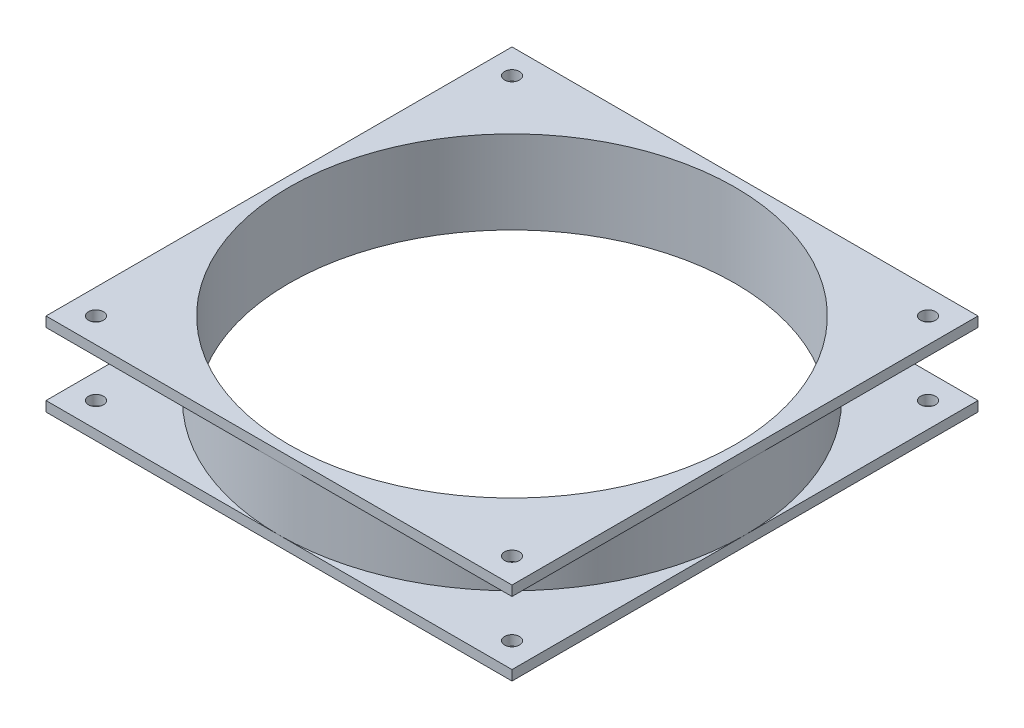
ISO-10303-21;
HEADER;
FILE_DESCRIPTION(('STEP AP214'),'2;1');
FILE_NAME('part.step','',(''),(''),'','','');
FILE_SCHEMA(('AUTOMOTIVE_DESIGN { 1 0 10303 214 1 1 1 1 }'));
ENDSEC;
DATA;
#1=APPLICATION_CONTEXT('core data for automotive mechanical design processes');
#2=APPLICATION_PROTOCOL_DEFINITION('international standard','automotive_design',2000,#1);
#3=PRODUCT_CONTEXT('',#1,'mechanical');
#4=PRODUCT('Part','Part','',(#3));
#5=PRODUCT_RELATED_PRODUCT_CATEGORY('part','',(#4));
#6=PRODUCT_DEFINITION_FORMATION('','',#4);
#7=PRODUCT_DEFINITION_CONTEXT('part definition',#1,'design');
#8=PRODUCT_DEFINITION('design','',#6,#7);
#9=PRODUCT_DEFINITION_SHAPE('','',#8);
#10=(LENGTH_UNIT() NAMED_UNIT(*) SI_UNIT(.MILLI.,.METRE.));
#11=(NAMED_UNIT(*) PLANE_ANGLE_UNIT() SI_UNIT($,.RADIAN.));
#12=(NAMED_UNIT(*) SI_UNIT($,.STERADIAN.) SOLID_ANGLE_UNIT());
#13=UNCERTAINTY_MEASURE_WITH_UNIT(LENGTH_MEASURE(1.E-05),#10,'distance_accuracy_value','');
#14=(GEOMETRIC_REPRESENTATION_CONTEXT(3) GLOBAL_UNCERTAINTY_ASSIGNED_CONTEXT((#13)) GLOBAL_UNIT_ASSIGNED_CONTEXT((#10,
#11,#12)) REPRESENTATION_CONTEXT('',''));
#15=CARTESIAN_POINT('',(0.,0.,0.));
#16=DIRECTION('',(0.,0.,1.));
#17=DIRECTION('',(1.,0.,0.));
#18=AXIS2_PLACEMENT_3D('',#15,#16,#17);
#19=CARTESIAN_POINT('',(67.,0.,0.));
#20=DIRECTION('',(0.,-1.,0.));
#21=DIRECTION('',(0.,0.,-1.));
#22=AXIS2_PLACEMENT_3D('',#19,#20,#21);
#23=PLANE('',#22);
#24=CARTESIAN_POINT('',(-62.5,0.,-62.5));
#25=DIRECTION('',(0.,1.,0.));
#26=DIRECTION('',(0.,0.,1.));
#27=AXIS2_PLACEMENT_3D('',#24,#25,#26);
#28=CIRCLE('',#27,2.25);
#29=CARTESIAN_POINT('',(-62.5,0.,-60.25));
#30=VERTEX_POINT('',#29);
#31=EDGE_CURVE('E308',#30,#30,#28,.T.);
#32=ORIENTED_EDGE('',*,*,#31,.T.);
#33=EDGE_LOOP('',(#32));
#34=FACE_BOUND('',#33,.T.);
#35=CARTESIAN_POINT('',(62.5,0.,62.5));
#36=DIRECTION('',(0.,1.,0.));
#37=DIRECTION('',(0.,0.,1.));
#38=AXIS2_PLACEMENT_3D('',#35,#36,#37);
#39=CIRCLE('',#38,2.25);
#40=CARTESIAN_POINT('',(62.5,0.,64.75));
#41=VERTEX_POINT('',#40);
#42=EDGE_CURVE('E228',#41,#41,#39,.T.);
#43=ORIENTED_EDGE('',*,*,#42,.T.);
#44=EDGE_LOOP('',(#43));
#45=FACE_BOUND('',#44,.T.);
#46=CARTESIAN_POINT('',(-62.5,0.,62.5));
#47=DIRECTION('',(0.,1.,0.));
#48=DIRECTION('',(0.,0.,1.));
#49=AXIS2_PLACEMENT_3D('',#46,#47,#48);
#50=CIRCLE('',#49,2.25);
#51=CARTESIAN_POINT('',(-62.5,0.,64.75));
#52=VERTEX_POINT('',#51);
#53=EDGE_CURVE('E224',#52,#52,#50,.T.);
#54=ORIENTED_EDGE('',*,*,#53,.T.);
#55=EDGE_LOOP('',(#54));
#56=FACE_BOUND('',#55,.T.);
#57=CARTESIAN_POINT('',(62.5,0.,-62.5));
#58=DIRECTION('',(0.,1.,0.));
#59=DIRECTION('',(0.,0.,1.));
#60=AXIS2_PLACEMENT_3D('',#57,#58,#59);
#61=CIRCLE('',#60,2.25);
#62=CARTESIAN_POINT('',(62.5,0.,-60.25));
#63=VERTEX_POINT('',#62);
#64=EDGE_CURVE('E220',#63,#63,#61,.T.);
#65=ORIENTED_EDGE('',*,*,#64,.T.);
#66=EDGE_LOOP('',(#65));
#67=FACE_BOUND('',#66,.T.);
#68=CARTESIAN_POINT('',(0.,0.,0.));
#69=DIRECTION('',(0.,-1.,0.));
#70=DIRECTION('',(0.,0.,-1.));
#71=AXIS2_PLACEMENT_3D('',#68,#69,#70);
#72=CIRCLE('',#71,67.);
#73=CARTESIAN_POINT('',(0.,0.,-67.));
#74=VERTEX_POINT('',#73);
#75=EDGE_CURVE('E12',#74,#74,#72,.T.);
#76=ORIENTED_EDGE('',*,*,#75,.F.);
#77=EDGE_LOOP('',(#76));
#78=FACE_BOUND('',#77,.T.);
#79=DIRECTION('',(-1.,0.,0.));
#80=VECTOR('',#79,1.);
#81=CARTESIAN_POINT('',(-70.,0.,-70.));
#82=LINE('',#81,#80);
#83=CARTESIAN_POINT('',(70.,0.,-70.));
#84=VERTEX_POINT('',#83);
#85=CARTESIAN_POINT('',(-70.,0.,-70.));
#86=VERTEX_POINT('',#85);
#87=EDGE_CURVE('E150',#84,#86,#82,.T.);
#88=ORIENTED_EDGE('',*,*,#87,.F.);
#89=DIRECTION('',(0.,0.,-1.));
#90=VECTOR('',#89,1.);
#91=CARTESIAN_POINT('',(70.,0.,70.));
#92=LINE('',#91,#90);
#93=CARTESIAN_POINT('',(70.,0.,70.));
#94=VERTEX_POINT('',#93);
#95=EDGE_CURVE('E57',#94,#84,#92,.T.);
#96=ORIENTED_EDGE('',*,*,#95,.F.);
#97=DIRECTION('',(1.,0.,0.));
#98=VECTOR('',#97,1.);
#99=CARTESIAN_POINT('',(-70.,0.,70.));
#100=LINE('',#99,#98);
#101=CARTESIAN_POINT('',(-70.,0.,70.));
#102=VERTEX_POINT('',#101);
#103=EDGE_CURVE('E137',#102,#94,#100,.T.);
#104=ORIENTED_EDGE('',*,*,#103,.F.);
#105=DIRECTION('',(0.,0.,1.));
#106=VECTOR('',#105,1.);
#107=CARTESIAN_POINT('',(-70.,0.,70.));
#108=LINE('',#107,#106);
#109=EDGE_CURVE('E146',#86,#102,#108,.T.);
#110=ORIENTED_EDGE('',*,*,#109,.F.);
#111=EDGE_LOOP('',(#88,#96,#104,#110));
#112=FACE_BOUND('',#111,.T.);
#113=ADVANCED_FACE('F40',(#34,#45,#56,#67,#78,#112),#23,.T.);
#114=CARTESIAN_POINT('',(0.,0.,0.));
#115=DIRECTION('',(0.,-1.,0.));
#116=DIRECTION('',(0.,0.,-1.));
#117=AXIS2_PLACEMENT_3D('',#114,#115,#116);
#118=CYLINDRICAL_SURFACE('',#117,67.);
#119=ORIENTED_EDGE('',*,*,#75,.T.);
#120=EDGE_LOOP('',(#119));
#121=FACE_BOUND('',#120,.T.);
#122=CARTESIAN_POINT('',(0.,25.,0.));
#123=DIRECTION('',(0.,-1.,0.));
#124=DIRECTION('',(0.,0.,-1.));
#125=AXIS2_PLACEMENT_3D('',#122,#123,#124);
#126=CIRCLE('',#125,67.);
#127=CARTESIAN_POINT('',(0.,25.,-67.));
#128=VERTEX_POINT('',#127);
#129=EDGE_CURVE('E205',#128,#128,#126,.T.);
#130=ORIENTED_EDGE('',*,*,#129,.F.);
#131=EDGE_LOOP('',(#130));
#132=FACE_BOUND('',#131,.T.);
#133=ADVANCED_FACE('F42',(#121,#132),#118,.F.);
#134=CARTESIAN_POINT('',(100.,25.,0.));
#135=DIRECTION('',(0.,1.,0.));
#136=DIRECTION('',(0.,0.,1.));
#137=AXIS2_PLACEMENT_3D('',#134,#135,#136);
#138=PLANE('',#137);
#139=CARTESIAN_POINT('',(-62.5,25.,-62.5));
#140=DIRECTION('',(0.,1.,0.));
#141=DIRECTION('',(0.,0.,1.));
#142=AXIS2_PLACEMENT_3D('',#139,#140,#141);
#143=CIRCLE('',#142,2.24999999999999);
#144=CARTESIAN_POINT('',(-62.5,25.,-60.25));
#145=VERTEX_POINT('',#144);
#146=EDGE_CURVE('E374',#145,#145,#143,.T.);
#147=ORIENTED_EDGE('',*,*,#146,.F.);
#148=EDGE_LOOP('',(#147));
#149=FACE_BOUND('',#148,.T.);
#150=CARTESIAN_POINT('',(62.5,25.,62.5));
#151=DIRECTION('',(0.,1.,0.));
#152=DIRECTION('',(0.,0.,1.));
#153=AXIS2_PLACEMENT_3D('',#150,#151,#152);
#154=CIRCLE('',#153,2.24999999999999);
#155=CARTESIAN_POINT('',(62.5,25.,64.75));
#156=VERTEX_POINT('',#155);
#157=EDGE_CURVE('E235',#156,#156,#154,.T.);
#158=ORIENTED_EDGE('',*,*,#157,.F.);
#159=EDGE_LOOP('',(#158));
#160=FACE_BOUND('',#159,.T.);
#161=CARTESIAN_POINT('',(-62.5,25.,62.5));
#162=DIRECTION('',(0.,1.,0.));
#163=DIRECTION('',(0.,0.,1.));
#164=AXIS2_PLACEMENT_3D('',#161,#162,#163);
#165=CIRCLE('',#164,2.24999999999999);
#166=CARTESIAN_POINT('',(-62.5,25.,64.75));
#167=VERTEX_POINT('',#166);
#168=EDGE_CURVE('E232',#167,#167,#165,.T.);
#169=ORIENTED_EDGE('',*,*,#168,.F.);
#170=EDGE_LOOP('',(#169));
#171=FACE_BOUND('',#170,.T.);
#172=CARTESIAN_POINT('',(62.5,25.,-62.5));
#173=DIRECTION('',(0.,1.,0.));
#174=DIRECTION('',(0.,0.,1.));
#175=AXIS2_PLACEMENT_3D('',#172,#173,#174);
#176=CIRCLE('',#175,2.24999999999999);
#177=CARTESIAN_POINT('',(62.5,25.,-60.25));
#178=VERTEX_POINT('',#177);
#179=EDGE_CURVE('E250',#178,#178,#176,.T.);
#180=ORIENTED_EDGE('',*,*,#179,.F.);
#181=EDGE_LOOP('',(#180));
#182=FACE_BOUND('',#181,.T.);
#183=ORIENTED_EDGE('',*,*,#129,.T.);
#184=EDGE_LOOP('',(#183));
#185=FACE_BOUND('',#184,.T.);
#186=DIRECTION('',(1.,0.,0.));
#187=VECTOR('',#186,1.);
#188=CARTESIAN_POINT('',(-70.,25.,70.));
#189=LINE('',#188,#187);
#190=CARTESIAN_POINT('',(-70.,25.,70.));
#191=VERTEX_POINT('',#190);
#192=CARTESIAN_POINT('',(70.,25.,70.));
#193=VERTEX_POINT('',#192);
#194=EDGE_CURVE('E168',#191,#193,#189,.T.);
#195=ORIENTED_EDGE('',*,*,#194,.T.);
#196=DIRECTION('',(0.,0.,-1.));
#197=VECTOR('',#196,1.);
#198=CARTESIAN_POINT('',(70.,25.,70.));
#199=LINE('',#198,#197);
#200=CARTESIAN_POINT('',(70.,25.,-70.));
#201=VERTEX_POINT('',#200);
#202=EDGE_CURVE('E158',#193,#201,#199,.T.);
#203=ORIENTED_EDGE('',*,*,#202,.T.);
#204=DIRECTION('',(-1.,0.,0.));
#205=VECTOR('',#204,1.);
#206=CARTESIAN_POINT('',(-70.,25.,-70.));
#207=LINE('',#206,#205);
#208=CARTESIAN_POINT('',(-70.,25.,-70.));
#209=VERTEX_POINT('',#208);
#210=EDGE_CURVE('E161',#201,#209,#207,.T.);
#211=ORIENTED_EDGE('',*,*,#210,.T.);
#212=DIRECTION('',(0.,0.,1.));
#213=VECTOR('',#212,1.);
#214=CARTESIAN_POINT('',(-70.,25.,70.));
#215=LINE('',#214,#213);
#216=EDGE_CURVE('E165',#209,#191,#215,.T.);
#217=ORIENTED_EDGE('',*,*,#216,.T.);
#218=EDGE_LOOP('',(#195,#203,#211,#217));
#219=FACE_BOUND('',#218,.T.);
#220=ADVANCED_FACE('F304',(#149,#160,#171,#182,#185,#219),#138,.T.);
#221=CARTESIAN_POINT('',(-70.,0.,-70.));
#222=DIRECTION('',(0.,0.,-1.));
#223=DIRECTION('',(-1.,0.,0.));
#224=AXIS2_PLACEMENT_3D('',#221,#222,#223);
#225=PLANE('',#224);
#226=DIRECTION('',(0.,1.,0.));
#227=VECTOR('',#226,1.);
#228=CARTESIAN_POINT('',(-70.,0.,-70.));
#229=LINE('',#228,#227);
#230=CARTESIAN_POINT('',(-70.,22.,-70.));
#231=VERTEX_POINT('',#230);
#232=EDGE_CURVE('E174',#231,#209,#229,.T.);
#233=ORIENTED_EDGE('',*,*,#232,.T.);
#234=ORIENTED_EDGE('',*,*,#210,.F.);
#235=DIRECTION('',(0.,1.,0.));
#236=VECTOR('',#235,1.);
#237=CARTESIAN_POINT('',(70.,0.,-70.));
#238=LINE('',#237,#236);
#239=CARTESIAN_POINT('',(70.,22.,-70.));
#240=VERTEX_POINT('',#239);
#241=EDGE_CURVE('E152',#240,#201,#238,.T.);
#242=ORIENTED_EDGE('',*,*,#241,.F.);
#243=DIRECTION('',(1.,0.,0.));
#244=VECTOR('',#243,1.);
#245=CARTESIAN_POINT('',(70.,22.,-70.));
#246=LINE('',#245,#244);
#247=CARTESIAN_POINT('',(0.,22.,-70.));
#248=VERTEX_POINT('',#247);
#249=EDGE_CURVE('E172',#248,#240,#246,.T.);
#250=ORIENTED_EDGE('',*,*,#249,.F.);
#251=EDGE_CURVE('E178',#231,#248,#246,.T.);
#252=ORIENTED_EDGE('',*,*,#251,.F.);
#253=EDGE_LOOP('',(#233,#234,#242,#250,#252));
#254=FACE_BOUND('',#253,.T.);
#255=ADVANCED_FACE('F319',(#254),#225,.T.);
#256=CARTESIAN_POINT('',(-70.,0.,70.));
#257=DIRECTION('',(-1.,0.,0.));
#258=DIRECTION('',(0.,0.,1.));
#259=AXIS2_PLACEMENT_3D('',#256,#257,#258);
#260=PLANE('',#259);
#261=DIRECTION('',(0.,1.,0.));
#262=VECTOR('',#261,1.);
#263=CARTESIAN_POINT('',(-70.,0.,70.));
#264=LINE('',#263,#262);
#265=CARTESIAN_POINT('',(-70.,22.,70.));
#266=VERTEX_POINT('',#265);
#267=EDGE_CURVE('E143',#266,#191,#264,.T.);
#268=ORIENTED_EDGE('',*,*,#267,.T.);
#269=ORIENTED_EDGE('',*,*,#216,.F.);
#270=ORIENTED_EDGE('',*,*,#232,.F.);
#271=DIRECTION('',(0.,0.,-1.));
#272=VECTOR('',#271,1.);
#273=CARTESIAN_POINT('',(-70.,22.,0.));
#274=LINE('',#273,#272);
#275=CARTESIAN_POINT('',(-70.,22.,0.));
#276=VERTEX_POINT('',#275);
#277=EDGE_CURVE('E183',#276,#231,#274,.T.);
#278=ORIENTED_EDGE('',*,*,#277,.F.);
#279=EDGE_CURVE('E186',#266,#276,#274,.T.);
#280=ORIENTED_EDGE('',*,*,#279,.F.);
#281=EDGE_LOOP('',(#268,#269,#270,#278,#280));
#282=FACE_BOUND('',#281,.T.);
#283=ADVANCED_FACE('F336',(#282),#260,.T.);
#284=CARTESIAN_POINT('',(-70.,0.,70.));
#285=DIRECTION('',(0.,0.,1.));
#286=DIRECTION('',(1.,0.,0.));
#287=AXIS2_PLACEMENT_3D('',#284,#285,#286);
#288=PLANE('',#287);
#289=DIRECTION('',(0.,1.,0.));
#290=VECTOR('',#289,1.);
#291=CARTESIAN_POINT('',(70.,0.,70.));
#292=LINE('',#291,#290);
#293=CARTESIAN_POINT('',(70.,22.,70.));
#294=VERTEX_POINT('',#293);
#295=EDGE_CURVE('E142',#294,#193,#292,.T.);
#296=ORIENTED_EDGE('',*,*,#295,.T.);
#297=ORIENTED_EDGE('',*,*,#194,.F.);
#298=ORIENTED_EDGE('',*,*,#267,.F.);
#299=DIRECTION('',(-1.,0.,0.));
#300=VECTOR('',#299,1.);
#301=CARTESIAN_POINT('',(70.,22.,70.));
#302=LINE('',#301,#300);
#303=CARTESIAN_POINT('',(0.,22.,70.));
#304=VERTEX_POINT('',#303);
#305=EDGE_CURVE('E190',#304,#266,#302,.T.);
#306=ORIENTED_EDGE('',*,*,#305,.F.);
#307=EDGE_CURVE('E193',#294,#304,#302,.T.);
#308=ORIENTED_EDGE('',*,*,#307,.F.);
#309=EDGE_LOOP('',(#296,#297,#298,#306,#308));
#310=FACE_BOUND('',#309,.T.);
#311=ADVANCED_FACE('F290',(#310),#288,.T.);
#312=CARTESIAN_POINT('',(70.,0.,70.));
#313=DIRECTION('',(1.,0.,0.));
#314=DIRECTION('',(0.,0.,-1.));
#315=AXIS2_PLACEMENT_3D('',#312,#313,#314);
#316=PLANE('',#315);
#317=ORIENTED_EDGE('',*,*,#241,.T.);
#318=ORIENTED_EDGE('',*,*,#202,.F.);
#319=ORIENTED_EDGE('',*,*,#295,.F.);
#320=DIRECTION('',(0.,0.,1.));
#321=VECTOR('',#320,1.);
#322=CARTESIAN_POINT('',(70.,22.,0.));
#323=LINE('',#322,#321);
#324=CARTESIAN_POINT('',(70.,22.,0.));
#325=VERTEX_POINT('',#324);
#326=EDGE_CURVE('E197',#325,#294,#323,.T.);
#327=ORIENTED_EDGE('',*,*,#326,.F.);
#328=EDGE_CURVE('E200',#240,#325,#323,.T.);
#329=ORIENTED_EDGE('',*,*,#328,.F.);
#330=EDGE_LOOP('',(#317,#318,#319,#327,#329));
#331=FACE_BOUND('',#330,.T.);
#332=ADVANCED_FACE('F281',(#331),#316,.T.);
#333=CARTESIAN_POINT('',(100.,3.,0.));
#334=DIRECTION('',(0.,1.,0.));
#335=DIRECTION('',(0.,0.,1.));
#336=AXIS2_PLACEMENT_3D('',#333,#334,#335);
#337=PLANE('',#336);
#338=CARTESIAN_POINT('',(-62.5,3.,62.5));
#339=DIRECTION('',(0.,1.,0.));
#340=DIRECTION('',(0.,0.,1.));
#341=AXIS2_PLACEMENT_3D('',#338,#339,#340);
#342=CIRCLE('',#341,2.24999999999999);
#343=CARTESIAN_POINT('',(-62.5,3.,64.75));
#344=VERTEX_POINT('',#343);
#345=EDGE_CURVE('E221',#344,#344,#342,.T.);
#346=ORIENTED_EDGE('',*,*,#345,.F.);
#347=EDGE_LOOP('',(#346));
#348=FACE_BOUND('',#347,.T.);
#349=DIRECTION('',(0.,0.,1.));
#350=VECTOR('',#349,1.);
#351=CARTESIAN_POINT('',(-70.,3.,0.));
#352=LINE('',#351,#350);
#353=CARTESIAN_POINT('',(-70.,3.,0.));
#354=VERTEX_POINT('',#353);
#355=CARTESIAN_POINT('',(-70.,3.,70.));
#356=VERTEX_POINT('',#355);
#357=EDGE_CURVE('E187',#354,#356,#352,.T.);
#358=ORIENTED_EDGE('',*,*,#357,.T.);
#359=DIRECTION('',(1.,0.,0.));
#360=VECTOR('',#359,1.);
#361=CARTESIAN_POINT('',(100.,3.,70.));
#362=LINE('',#361,#360);
#363=CARTESIAN_POINT('',(0.,3.,70.));
#364=VERTEX_POINT('',#363);
#365=EDGE_CURVE('E139',#356,#364,#362,.T.);
#366=ORIENTED_EDGE('',*,*,#365,.T.);
#367=CARTESIAN_POINT('',(0.,3.,0.));
#368=DIRECTION('',(0.,-1.,0.));
#369=DIRECTION('',(0.,0.,-1.));
#370=AXIS2_PLACEMENT_3D('',#367,#368,#369);
#371=CIRCLE('',#370,70.);
#372=EDGE_CURVE('E272',#364,#354,#371,.T.);
#373=ORIENTED_EDGE('',*,*,#372,.T.);
#374=EDGE_LOOP('',(#358,#366,#373));
#375=FACE_BOUND('',#374,.T.);
#376=ADVANCED_FACE('F278',(#348,#375),#337,.T.);
#377=CARTESIAN_POINT('',(62.5,3.,62.5));
#378=DIRECTION('',(0.,1.,0.));
#379=DIRECTION('',(0.,0.,1.));
#380=AXIS2_PLACEMENT_3D('',#377,#378,#379);
#381=CIRCLE('',#380,2.25);
#382=CARTESIAN_POINT('',(62.5,3.,64.75));
#383=VERTEX_POINT('',#382);
#384=EDGE_CURVE('E227',#383,#383,#381,.T.);
#385=ORIENTED_EDGE('',*,*,#384,.F.);
#386=EDGE_LOOP('',(#385));
#387=FACE_BOUND('',#386,.T.);
#388=CARTESIAN_POINT('',(70.,3.,0.));
#389=VERTEX_POINT('',#388);
#390=EDGE_CURVE('E215',#389,#364,#371,.T.);
#391=ORIENTED_EDGE('',*,*,#390,.T.);
#392=CARTESIAN_POINT('',(70.,3.,70.));
#393=VERTEX_POINT('',#392);
#394=EDGE_CURVE('E194',#364,#393,#362,.T.);
#395=ORIENTED_EDGE('',*,*,#394,.T.);
#396=DIRECTION('',(0.,0.,-1.));
#397=VECTOR('',#396,1.);
#398=CARTESIAN_POINT('',(70.,3.,0.));
#399=LINE('',#398,#397);
#400=EDGE_CURVE('E204',#393,#389,#399,.T.);
#401=ORIENTED_EDGE('',*,*,#400,.T.);
#402=EDGE_LOOP('',(#391,#395,#401));
#403=FACE_BOUND('',#402,.T.);
#404=ADVANCED_FACE('F280',(#387,#403),#337,.T.);
#405=CARTESIAN_POINT('',(62.5,3.,-62.5));
#406=DIRECTION('',(0.,1.,0.));
#407=DIRECTION('',(0.,0.,1.));
#408=AXIS2_PLACEMENT_3D('',#405,#406,#407);
#409=CIRCLE('',#408,2.25);
#410=CARTESIAN_POINT('',(62.5,3.,-60.25));
#411=VERTEX_POINT('',#410);
#412=EDGE_CURVE('E217',#411,#411,#409,.T.);
#413=ORIENTED_EDGE('',*,*,#412,.F.);
#414=EDGE_LOOP('',(#413));
#415=FACE_BOUND('',#414,.T.);
#416=CARTESIAN_POINT('',(0.,3.,-70.));
#417=VERTEX_POINT('',#416);
#418=EDGE_CURVE('E49',#417,#389,#371,.T.);
#419=ORIENTED_EDGE('',*,*,#418,.T.);
#420=CARTESIAN_POINT('',(70.,3.,-70.));
#421=VERTEX_POINT('',#420);
#422=EDGE_CURVE('E201',#389,#421,#399,.T.);
#423=ORIENTED_EDGE('',*,*,#422,.T.);
#424=DIRECTION('',(-1.,0.,0.));
#425=VECTOR('',#424,1.);
#426=CARTESIAN_POINT('',(100.,3.,-70.));
#427=LINE('',#426,#425);
#428=EDGE_CURVE('E182',#421,#417,#427,.T.);
#429=ORIENTED_EDGE('',*,*,#428,.T.);
#430=EDGE_LOOP('',(#419,#423,#429));
#431=FACE_BOUND('',#430,.T.);
#432=ADVANCED_FACE('F262',(#415,#431),#337,.T.);
#433=CARTESIAN_POINT('',(-62.5,3.,-62.5));
#434=DIRECTION('',(0.,1.,0.));
#435=DIRECTION('',(0.,0.,1.));
#436=AXIS2_PLACEMENT_3D('',#433,#434,#435);
#437=CIRCLE('',#436,2.24999999999999);
#438=CARTESIAN_POINT('',(-62.5,3.,-60.25));
#439=VERTEX_POINT('',#438);
#440=EDGE_CURVE('E240',#439,#439,#437,.T.);
#441=ORIENTED_EDGE('',*,*,#440,.F.);
#442=EDGE_LOOP('',(#441));
#443=FACE_BOUND('',#442,.T.);
#444=CARTESIAN_POINT('',(-70.,3.,-70.));
#445=VERTEX_POINT('',#444);
#446=EDGE_CURVE('E179',#417,#445,#427,.T.);
#447=ORIENTED_EDGE('',*,*,#446,.T.);
#448=EDGE_CURVE('E189',#445,#354,#352,.T.);
#449=ORIENTED_EDGE('',*,*,#448,.T.);
#450=EDGE_CURVE('E212',#354,#417,#371,.T.);
#451=ORIENTED_EDGE('',*,*,#450,.T.);
#452=EDGE_LOOP('',(#447,#449,#451));
#453=FACE_BOUND('',#452,.T.);
#454=ADVANCED_FACE('F277',(#443,#453),#337,.T.);
#455=CARTESIAN_POINT('',(70.,22.,0.));
#456=DIRECTION('',(0.,-1.,0.));
#457=DIRECTION('',(0.,0.,-1.));
#458=AXIS2_PLACEMENT_3D('',#455,#456,#457);
#459=PLANE('',#458);
#460=CARTESIAN_POINT('',(62.5,22.,-62.5));
#461=DIRECTION('',(0.,-1.,0.));
#462=DIRECTION('',(0.,0.,-1.));
#463=AXIS2_PLACEMENT_3D('',#460,#461,#462);
#464=CIRCLE('',#463,2.25);
#465=CARTESIAN_POINT('',(62.5,22.,-64.75));
#466=VERTEX_POINT('',#465);
#467=EDGE_CURVE('E162',#466,#466,#464,.T.);
#468=ORIENTED_EDGE('',*,*,#467,.F.);
#469=EDGE_LOOP('',(#468));
#470=FACE_BOUND('',#469,.T.);
#471=ORIENTED_EDGE('',*,*,#249,.T.);
#472=ORIENTED_EDGE('',*,*,#328,.T.);
#473=CARTESIAN_POINT('',(0.,22.,0.));
#474=DIRECTION('',(0.,-1.,0.));
#475=DIRECTION('',(0.,0.,-1.));
#476=AXIS2_PLACEMENT_3D('',#473,#474,#475);
#477=CIRCLE('',#476,70.);
#478=EDGE_CURVE('E209',#248,#325,#477,.T.);
#479=ORIENTED_EDGE('',*,*,#478,.F.);
#480=EDGE_LOOP('',(#471,#472,#479));
#481=FACE_BOUND('',#480,.T.);
#482=ADVANCED_FACE('F296',(#470,#481),#459,.T.);
#483=CARTESIAN_POINT('',(62.5,22.,62.5));
#484=DIRECTION('',(0.,-1.,0.));
#485=DIRECTION('',(0.,0.,-1.));
#486=AXIS2_PLACEMENT_3D('',#483,#484,#485);
#487=CIRCLE('',#486,2.25);
#488=CARTESIAN_POINT('',(62.5,22.,60.25));
#489=VERTEX_POINT('',#488);
#490=EDGE_CURVE('E225',#489,#489,#487,.T.);
#491=ORIENTED_EDGE('',*,*,#490,.F.);
#492=EDGE_LOOP('',(#491));
#493=FACE_BOUND('',#492,.T.);
#494=EDGE_CURVE('E213',#325,#304,#477,.T.);
#495=ORIENTED_EDGE('',*,*,#494,.F.);
#496=ORIENTED_EDGE('',*,*,#326,.T.);
#497=ORIENTED_EDGE('',*,*,#307,.T.);
#498=EDGE_LOOP('',(#495,#496,#497));
#499=FACE_BOUND('',#498,.T.);
#500=ADVANCED_FACE('F352',(#493,#499),#459,.T.);
#501=CARTESIAN_POINT('',(-62.5,22.,62.5));
#502=DIRECTION('',(0.,-1.,0.));
#503=DIRECTION('',(0.,0.,-1.));
#504=AXIS2_PLACEMENT_3D('',#501,#502,#503);
#505=CIRCLE('',#504,2.24999999999999);
#506=CARTESIAN_POINT('',(-62.5,22.,60.25));
#507=VERTEX_POINT('',#506);
#508=EDGE_CURVE('E223',#507,#507,#505,.T.);
#509=ORIENTED_EDGE('',*,*,#508,.F.);
#510=EDGE_LOOP('',(#509));
#511=FACE_BOUND('',#510,.T.);
#512=EDGE_CURVE('E345',#304,#276,#477,.T.);
#513=ORIENTED_EDGE('',*,*,#512,.F.);
#514=ORIENTED_EDGE('',*,*,#305,.T.);
#515=ORIENTED_EDGE('',*,*,#279,.T.);
#516=EDGE_LOOP('',(#513,#514,#515));
#517=FACE_BOUND('',#516,.T.);
#518=ADVANCED_FACE('F350',(#511,#517),#459,.T.);
#519=CARTESIAN_POINT('',(-62.5,22.,-62.5));
#520=DIRECTION('',(0.,-1.,0.));
#521=DIRECTION('',(0.,0.,-1.));
#522=AXIS2_PLACEMENT_3D('',#519,#520,#521);
#523=CIRCLE('',#522,2.24999999999999);
#524=CARTESIAN_POINT('',(-62.5,22.,-64.75));
#525=VERTEX_POINT('',#524);
#526=EDGE_CURVE('E44',#525,#525,#523,.T.);
#527=ORIENTED_EDGE('',*,*,#526,.F.);
#528=EDGE_LOOP('',(#527));
#529=FACE_BOUND('',#528,.T.);
#530=EDGE_CURVE('E208',#276,#248,#477,.T.);
#531=ORIENTED_EDGE('',*,*,#530,.F.);
#532=ORIENTED_EDGE('',*,*,#277,.T.);
#533=ORIENTED_EDGE('',*,*,#251,.T.);
#534=EDGE_LOOP('',(#531,#532,#533));
#535=FACE_BOUND('',#534,.T.);
#536=ADVANCED_FACE('F340',(#529,#535),#459,.T.);
#537=CARTESIAN_POINT('',(0.,0.,0.));
#538=DIRECTION('',(0.,-1.,0.));
#539=DIRECTION('',(0.,0.,-1.));
#540=AXIS2_PLACEMENT_3D('',#537,#538,#539);
#541=CYLINDRICAL_SURFACE('',#540,70.);
#542=ORIENTED_EDGE('',*,*,#478,.T.);
#543=ORIENTED_EDGE('',*,*,#494,.T.);
#544=ORIENTED_EDGE('',*,*,#512,.T.);
#545=ORIENTED_EDGE('',*,*,#530,.T.);
#546=EDGE_LOOP('',(#542,#543,#544,#545));
#547=FACE_BOUND('',#546,.T.);
#548=ORIENTED_EDGE('',*,*,#390,.F.);
#549=ORIENTED_EDGE('',*,*,#418,.F.);
#550=ORIENTED_EDGE('',*,*,#450,.F.);
#551=ORIENTED_EDGE('',*,*,#372,.F.);
#552=EDGE_LOOP('',(#548,#549,#550,#551));
#553=FACE_BOUND('',#552,.T.);
#554=ADVANCED_FACE('F268',(#547,#553),#541,.T.);
#555=EDGE_CURVE('E171',#94,#393,#292,.T.);
#556=ORIENTED_EDGE('',*,*,#555,.F.);
#557=ORIENTED_EDGE('',*,*,#95,.T.);
#558=EDGE_CURVE('E154',#84,#421,#238,.T.);
#559=ORIENTED_EDGE('',*,*,#558,.T.);
#560=ORIENTED_EDGE('',*,*,#422,.F.);
#561=ORIENTED_EDGE('',*,*,#400,.F.);
#562=EDGE_LOOP('',(#556,#557,#559,#560,#561));
#563=FACE_BOUND('',#562,.T.);
#564=ADVANCED_FACE('F259',(#563),#316,.T.);
#565=EDGE_CURVE('E132',#102,#356,#264,.T.);
#566=ORIENTED_EDGE('',*,*,#565,.F.);
#567=ORIENTED_EDGE('',*,*,#103,.T.);
#568=ORIENTED_EDGE('',*,*,#555,.T.);
#569=ORIENTED_EDGE('',*,*,#394,.F.);
#570=ORIENTED_EDGE('',*,*,#365,.F.);
#571=EDGE_LOOP('',(#566,#567,#568,#569,#570));
#572=FACE_BOUND('',#571,.T.);
#573=ADVANCED_FACE('F134',(#572),#288,.T.);
#574=EDGE_CURVE('E65',#86,#445,#229,.T.);
#575=ORIENTED_EDGE('',*,*,#574,.F.);
#576=ORIENTED_EDGE('',*,*,#109,.T.);
#577=ORIENTED_EDGE('',*,*,#565,.T.);
#578=ORIENTED_EDGE('',*,*,#357,.F.);
#579=ORIENTED_EDGE('',*,*,#448,.F.);
#580=EDGE_LOOP('',(#575,#576,#577,#578,#579));
#581=FACE_BOUND('',#580,.T.);
#582=ADVANCED_FACE('F147',(#581),#260,.T.);
#583=ORIENTED_EDGE('',*,*,#558,.F.);
#584=ORIENTED_EDGE('',*,*,#87,.T.);
#585=ORIENTED_EDGE('',*,*,#574,.T.);
#586=ORIENTED_EDGE('',*,*,#446,.F.);
#587=ORIENTED_EDGE('',*,*,#428,.F.);
#588=EDGE_LOOP('',(#583,#584,#585,#586,#587));
#589=FACE_BOUND('',#588,.T.);
#590=ADVANCED_FACE('F257',(#589),#225,.T.);
#591=CARTESIAN_POINT('',(62.5,25.,-62.5));
#592=DIRECTION('',(0.,1.,0.));
#593=DIRECTION('',(0.,0.,1.));
#594=AXIS2_PLACEMENT_3D('',#591,#592,#593);
#595=CYLINDRICAL_SURFACE('',#594,2.25);
#596=ORIENTED_EDGE('',*,*,#412,.T.);
#597=EDGE_LOOP('',(#596));
#598=FACE_BOUND('',#597,.T.);
#599=ORIENTED_EDGE('',*,*,#64,.F.);
#600=EDGE_LOOP('',(#599));
#601=FACE_BOUND('',#600,.T.);
#602=ADVANCED_FACE('F391',(#598,#601),#595,.F.);
#603=ORIENTED_EDGE('',*,*,#467,.T.);
#604=EDGE_LOOP('',(#603));
#605=FACE_BOUND('',#604,.T.);
#606=ORIENTED_EDGE('',*,*,#179,.T.);
#607=EDGE_LOOP('',(#606));
#608=FACE_BOUND('',#607,.T.);
#609=ADVANCED_FACE('F388',(#605,#608),#595,.F.);
#610=CARTESIAN_POINT('',(-62.5,25.,62.5));
#611=DIRECTION('',(0.,1.,0.));
#612=DIRECTION('',(0.,0.,1.));
#613=AXIS2_PLACEMENT_3D('',#610,#611,#612);
#614=CYLINDRICAL_SURFACE('',#613,2.24999999999999);
#615=ORIENTED_EDGE('',*,*,#345,.T.);
#616=EDGE_LOOP('',(#615));
#617=FACE_BOUND('',#616,.T.);
#618=ORIENTED_EDGE('',*,*,#53,.F.);
#619=EDGE_LOOP('',(#618));
#620=FACE_BOUND('',#619,.T.);
#621=ADVANCED_FACE('F390',(#617,#620),#614,.F.);
#622=ORIENTED_EDGE('',*,*,#508,.T.);
#623=EDGE_LOOP('',(#622));
#624=FACE_BOUND('',#623,.T.);
#625=ORIENTED_EDGE('',*,*,#168,.T.);
#626=EDGE_LOOP('',(#625));
#627=FACE_BOUND('',#626,.T.);
#628=ADVANCED_FACE('F397',(#624,#627),#614,.F.);
#629=CARTESIAN_POINT('',(62.5,25.,62.5));
#630=DIRECTION('',(0.,1.,0.));
#631=DIRECTION('',(0.,0.,1.));
#632=AXIS2_PLACEMENT_3D('',#629,#630,#631);
#633=CYLINDRICAL_SURFACE('',#632,2.25);
#634=ORIENTED_EDGE('',*,*,#490,.T.);
#635=EDGE_LOOP('',(#634));
#636=FACE_BOUND('',#635,.T.);
#637=ORIENTED_EDGE('',*,*,#157,.T.);
#638=EDGE_LOOP('',(#637));
#639=FACE_BOUND('',#638,.T.);
#640=ADVANCED_FACE('F546',(#636,#639),#633,.F.);
#641=ORIENTED_EDGE('',*,*,#384,.T.);
#642=EDGE_LOOP('',(#641));
#643=FACE_BOUND('',#642,.T.);
#644=ORIENTED_EDGE('',*,*,#42,.F.);
#645=EDGE_LOOP('',(#644));
#646=FACE_BOUND('',#645,.T.);
#647=ADVANCED_FACE('F554',(#643,#646),#633,.F.);
#648=CARTESIAN_POINT('',(-62.5,25.,-62.5));
#649=DIRECTION('',(0.,1.,0.));
#650=DIRECTION('',(0.,0.,1.));
#651=AXIS2_PLACEMENT_3D('',#648,#649,#650);
#652=CYLINDRICAL_SURFACE('',#651,2.24999999999999);
#653=ORIENTED_EDGE('',*,*,#526,.T.);
#654=EDGE_LOOP('',(#653));
#655=FACE_BOUND('',#654,.T.);
#656=ORIENTED_EDGE('',*,*,#146,.T.);
#657=EDGE_LOOP('',(#656));
#658=FACE_BOUND('',#657,.T.);
#659=ADVANCED_FACE('F380',(#655,#658),#652,.F.);
#660=ORIENTED_EDGE('',*,*,#440,.T.);
#661=EDGE_LOOP('',(#660));
#662=FACE_BOUND('',#661,.T.);
#663=ORIENTED_EDGE('',*,*,#31,.F.);
#664=EDGE_LOOP('',(#663));
#665=FACE_BOUND('',#664,.T.);
#666=ADVANCED_FACE('F568',(#662,#665),#652,.F.);
#667=CLOSED_SHELL('',(#113,#133,#220,#255,#283,#311,#332,#376,#404,#432,#454,#482,#500,#518,
#536,#554,#564,#573,#582,#590,#602,#609,#621,#628,#640,#647,#659,#666));
#668=MANIFOLD_SOLID_BREP('B2',#667);
#669=ADVANCED_BREP_SHAPE_REPRESENTATION('',(#18,#668),#14);
#670=SHAPE_DEFINITION_REPRESENTATION(#9,#669);
ENDSEC;
END-ISO-10303-21;
